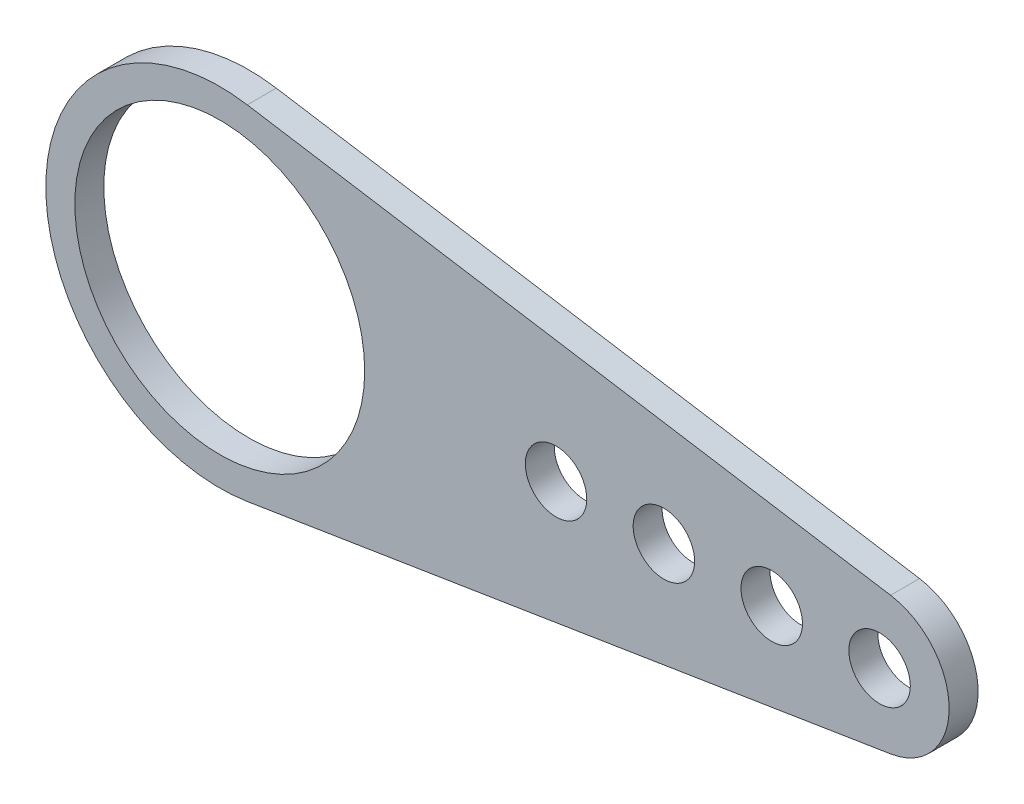
ISO-10303-21;
HEADER;
FILE_DESCRIPTION(('STEP AP214'),'2;1');
FILE_NAME('part.step','',(''),(''),'','','');
FILE_SCHEMA(('AUTOMOTIVE_DESIGN { 1 0 10303 214 1 1 1 1 }'));
ENDSEC;
DATA;
#1=APPLICATION_CONTEXT('core data for automotive mechanical design processes');
#2=APPLICATION_PROTOCOL_DEFINITION('international standard','automotive_design',2000,#1);
#3=PRODUCT_CONTEXT('',#1,'mechanical');
#4=PRODUCT('Part','Part','',(#3));
#5=PRODUCT_RELATED_PRODUCT_CATEGORY('part','',(#4));
#6=PRODUCT_DEFINITION_FORMATION('','',#4);
#7=PRODUCT_DEFINITION_CONTEXT('part definition',#1,'design');
#8=PRODUCT_DEFINITION('design','',#6,#7);
#9=PRODUCT_DEFINITION_SHAPE('','',#8);
#10=(LENGTH_UNIT() NAMED_UNIT(*) SI_UNIT(.MILLI.,.METRE.));
#11=(NAMED_UNIT(*) PLANE_ANGLE_UNIT() SI_UNIT($,.RADIAN.));
#12=(NAMED_UNIT(*) SI_UNIT($,.STERADIAN.) SOLID_ANGLE_UNIT());
#13=UNCERTAINTY_MEASURE_WITH_UNIT(LENGTH_MEASURE(1.E-05),#10,'distance_accuracy_value','');
#14=(GEOMETRIC_REPRESENTATION_CONTEXT(3) GLOBAL_UNCERTAINTY_ASSIGNED_CONTEXT((#13)) GLOBAL_UNIT_ASSIGNED_CONTEXT((#10,
#11,#12)) REPRESENTATION_CONTEXT('',''));
#15=CARTESIAN_POINT('',(0.,0.,0.));
#16=DIRECTION('',(0.,0.,1.));
#17=DIRECTION('',(1.,0.,0.));
#18=AXIS2_PLACEMENT_3D('',#15,#16,#17);
#19=CARTESIAN_POINT('',(0.,0.,3.175));
#20=DIRECTION('',(0.,0.,-1.));
#21=DIRECTION('',(-1.,0.,0.));
#22=AXIS2_PLACEMENT_3D('',#19,#20,#21);
#23=CYLINDRICAL_SURFACE('',#22,19.05);
#24=CARTESIAN_POINT('',(0.,0.,0.));
#25=DIRECTION('',(0.,0.,1.));
#26=DIRECTION('',(1.,0.,0.));
#27=AXIS2_PLACEMENT_3D('',#24,#25,#26);
#28=CIRCLE('',#27,19.05);
#29=CARTESIAN_POINT('',(3.01318101933216,18.8101897955533,0.));
#30=VERTEX_POINT('',#29);
#31=CARTESIAN_POINT('',(3.01318101933216,-18.8101897955533,0.));
#32=VERTEX_POINT('',#31);
#33=EDGE_CURVE('E119',#30,#32,#28,.T.);
#34=ORIENTED_EDGE('',*,*,#33,.T.);
#35=DIRECTION('',(0.,0.,-1.));
#36=VECTOR('',#35,1.);
#37=CARTESIAN_POINT('',(3.01318101933216,-18.8101897955533,3.175));
#38=LINE('',#37,#36);
#39=CARTESIAN_POINT('',(3.01318101933216,-18.8101897955533,3.175));
#40=VERTEX_POINT('',#39);
#41=EDGE_CURVE('E11',#40,#32,#38,.T.);
#42=ORIENTED_EDGE('',*,*,#41,.F.);
#43=CARTESIAN_POINT('',(0.,0.,3.175));
#44=DIRECTION('',(0.,0.,1.));
#45=DIRECTION('',(1.,0.,0.));
#46=AXIS2_PLACEMENT_3D('',#43,#44,#45);
#47=CIRCLE('',#46,19.05);
#48=CARTESIAN_POINT('',(3.01318101933216,18.8101897955533,3.175));
#49=VERTEX_POINT('',#48);
#50=EDGE_CURVE('E97',#49,#40,#47,.T.);
#51=ORIENTED_EDGE('',*,*,#50,.F.);
#52=DIRECTION('',(0.,0.,-1.));
#53=VECTOR('',#52,1.);
#54=CARTESIAN_POINT('',(3.01318101933216,18.8101897955533,3.175));
#55=LINE('',#54,#53);
#56=EDGE_CURVE('E64',#49,#30,#55,.T.);
#57=ORIENTED_EDGE('',*,*,#56,.T.);
#58=EDGE_LOOP('',(#34,#42,#51,#57));
#59=FACE_BOUND('',#58,.T.);
#60=ADVANCED_FACE('F46',(#59),#23,.T.);
#61=CARTESIAN_POINT('',(3.01318101933216,-18.8101897955532,3.175));
#62=DIRECTION('',(-0.15817223198594,0.987411537824319,0.));
#63=DIRECTION('',(-0.987411537824319,-0.15817223198594,0.));
#64=AXIS2_PLACEMENT_3D('',#61,#62,#63);
#65=PLANE('',#64);
#66=DIRECTION('',(0.987411537824319,0.15817223198594,0.));
#67=VECTOR('',#66,1.);
#68=CARTESIAN_POINT('',(3.01318101933216,-18.8101897955532,0.));
#69=LINE('',#68,#67);
#70=CARTESIAN_POINT('',(73.4682724077329,-7.5240759182213,0.));
#71=VERTEX_POINT('',#70);
#72=EDGE_CURVE('E103',#32,#71,#69,.T.);
#73=ORIENTED_EDGE('',*,*,#72,.T.);
#74=DIRECTION('',(0.,0.,-1.));
#75=VECTOR('',#74,1.);
#76=CARTESIAN_POINT('',(73.4682724077329,-7.5240759182213,3.175));
#77=LINE('',#76,#75);
#78=CARTESIAN_POINT('',(73.4682724077329,-7.5240759182213,3.175));
#79=VERTEX_POINT('',#78);
#80=EDGE_CURVE('E56',#79,#71,#77,.T.);
#81=ORIENTED_EDGE('',*,*,#80,.F.);
#82=DIRECTION('',(0.987411537824319,0.15817223198594,0.));
#83=VECTOR('',#82,1.);
#84=CARTESIAN_POINT('',(3.01318101933216,-18.8101897955532,3.175));
#85=LINE('',#84,#83);
#86=EDGE_CURVE('E90',#40,#79,#85,.T.);
#87=ORIENTED_EDGE('',*,*,#86,.F.);
#88=ORIENTED_EDGE('',*,*,#41,.T.);
#89=EDGE_LOOP('',(#73,#81,#87,#88));
#90=FACE_BOUND('',#89,.T.);
#91=ADVANCED_FACE('F102',(#90),#65,.F.);
#92=CARTESIAN_POINT('',(72.263,0.,3.175));
#93=DIRECTION('',(0.,0.,-1.));
#94=DIRECTION('',(-1.,0.,0.));
#95=AXIS2_PLACEMENT_3D('',#92,#93,#94);
#96=CYLINDRICAL_SURFACE('',#95,7.62);
#97=CARTESIAN_POINT('',(72.263,0.,0.));
#98=DIRECTION('',(0.,0.,1.));
#99=DIRECTION('',(1.,0.,0.));
#100=AXIS2_PLACEMENT_3D('',#97,#98,#99);
#101=CIRCLE('',#100,7.62);
#102=CARTESIAN_POINT('',(73.4682724077329,7.5240759182213,0.));
#103=VERTEX_POINT('',#102);
#104=EDGE_CURVE('E125',#71,#103,#101,.T.);
#105=ORIENTED_EDGE('',*,*,#104,.T.);
#106=DIRECTION('',(0.,0.,-1.));
#107=VECTOR('',#106,1.);
#108=CARTESIAN_POINT('',(73.4682724077329,7.5240759182213,3.175));
#109=LINE('',#108,#107);
#110=CARTESIAN_POINT('',(73.4682724077329,7.5240759182213,3.175));
#111=VERTEX_POINT('',#110);
#112=EDGE_CURVE('E79',#111,#103,#109,.T.);
#113=ORIENTED_EDGE('',*,*,#112,.F.);
#114=CARTESIAN_POINT('',(72.263,0.,3.175));
#115=DIRECTION('',(0.,0.,1.));
#116=DIRECTION('',(1.,0.,0.));
#117=AXIS2_PLACEMENT_3D('',#114,#115,#116);
#118=CIRCLE('',#117,7.62);
#119=EDGE_CURVE('E96',#79,#111,#118,.T.);
#120=ORIENTED_EDGE('',*,*,#119,.F.);
#121=ORIENTED_EDGE('',*,*,#80,.T.);
#122=EDGE_LOOP('',(#105,#113,#120,#121));
#123=FACE_BOUND('',#122,.T.);
#124=ADVANCED_FACE('F107',(#123),#96,.T.);
#125=CARTESIAN_POINT('',(0.,0.,3.175));
#126=DIRECTION('',(0.,0.,-1.));
#127=DIRECTION('',(-1.,0.,0.));
#128=AXIS2_PLACEMENT_3D('',#125,#126,#127);
#129=CYLINDRICAL_SURFACE('',#128,15.875);
#130=CARTESIAN_POINT('',(0.,0.,3.175));
#131=DIRECTION('',(0.,0.,1.));
#132=DIRECTION('',(1.,0.,0.));
#133=AXIS2_PLACEMENT_3D('',#130,#131,#132);
#134=CIRCLE('',#133,15.875);
#135=CARTESIAN_POINT('',(15.875,0.,3.175));
#136=VERTEX_POINT('',#135);
#137=EDGE_CURVE('E132',#136,#136,#134,.T.);
#138=ORIENTED_EDGE('',*,*,#137,.T.);
#139=EDGE_LOOP('',(#138));
#140=FACE_BOUND('',#139,.T.);
#141=CARTESIAN_POINT('',(0.,0.,0.));
#142=DIRECTION('',(0.,0.,1.));
#143=DIRECTION('',(1.,0.,0.));
#144=AXIS2_PLACEMENT_3D('',#141,#142,#143);
#145=CIRCLE('',#144,15.875);
#146=CARTESIAN_POINT('',(15.875,0.,0.));
#147=VERTEX_POINT('',#146);
#148=EDGE_CURVE('E115',#147,#147,#145,.T.);
#149=ORIENTED_EDGE('',*,*,#148,.F.);
#150=EDGE_LOOP('',(#149));
#151=FACE_BOUND('',#150,.T.);
#152=ADVANCED_FACE('F48',(#140,#151),#129,.F.);
#153=CARTESIAN_POINT('',(3.01318101933216,18.8101897955532,3.175));
#154=DIRECTION('',(0.15817223198594,0.987411537824319,0.));
#155=DIRECTION('',(-0.987411537824319,0.15817223198594,0.));
#156=AXIS2_PLACEMENT_3D('',#153,#154,#155);
#157=PLANE('',#156);
#158=DIRECTION('',(0.987411537824319,-0.15817223198594,0.));
#159=VECTOR('',#158,1.);
#160=CARTESIAN_POINT('',(3.01318101933216,18.8101897955532,0.));
#161=LINE('',#160,#159);
#162=EDGE_CURVE('E128',#30,#103,#161,.T.);
#163=ORIENTED_EDGE('',*,*,#162,.F.);
#164=ORIENTED_EDGE('',*,*,#56,.F.);
#165=DIRECTION('',(0.987411537824319,-0.15817223198594,0.));
#166=VECTOR('',#165,1.);
#167=CARTESIAN_POINT('',(3.01318101933216,18.8101897955532,3.175));
#168=LINE('',#167,#166);
#169=EDGE_CURVE('E109',#49,#111,#168,.T.);
#170=ORIENTED_EDGE('',*,*,#169,.T.);
#171=ORIENTED_EDGE('',*,*,#112,.T.);
#172=EDGE_LOOP('',(#163,#164,#170,#171));
#173=FACE_BOUND('',#172,.T.);
#174=ADVANCED_FACE('F188',(#173),#157,.T.);
#175=CARTESIAN_POINT('',(0.,0.,3.175));
#176=DIRECTION('',(0.,0.,1.));
#177=DIRECTION('',(1.,0.,0.));
#178=AXIS2_PLACEMENT_3D('',#175,#176,#177);
#179=PLANE('',#178);
#180=CARTESIAN_POINT('',(36.83,0.,3.175));
#181=DIRECTION('',(0.,0.,1.));
#182=DIRECTION('',(1.,0.,0.));
#183=AXIS2_PLACEMENT_3D('',#180,#181,#182);
#184=CIRCLE('',#183,3.36549999999999);
#185=CARTESIAN_POINT('',(40.1955,0.,3.175));
#186=VERTEX_POINT('',#185);
#187=EDGE_CURVE('E120',#186,#186,#184,.T.);
#188=ORIENTED_EDGE('',*,*,#187,.F.);
#189=EDGE_LOOP('',(#188));
#190=FACE_BOUND('',#189,.T.);
#191=CARTESIAN_POINT('',(48.641,0.,3.175));
#192=DIRECTION('',(0.,0.,1.));
#193=DIRECTION('',(1.,0.,0.));
#194=AXIS2_PLACEMENT_3D('',#191,#192,#193);
#195=CIRCLE('',#194,3.36549999999999);
#196=CARTESIAN_POINT('',(52.0065,0.,3.175));
#197=VERTEX_POINT('',#196);
#198=EDGE_CURVE('E161',#197,#197,#195,.T.);
#199=ORIENTED_EDGE('',*,*,#198,.F.);
#200=EDGE_LOOP('',(#199));
#201=FACE_BOUND('',#200,.T.);
#202=CARTESIAN_POINT('',(60.452,0.,3.175));
#203=DIRECTION('',(0.,0.,1.));
#204=DIRECTION('',(1.,0.,0.));
#205=AXIS2_PLACEMENT_3D('',#202,#203,#204);
#206=CIRCLE('',#205,3.36549999999998);
#207=CARTESIAN_POINT('',(63.8175,0.,3.175));
#208=VERTEX_POINT('',#207);
#209=EDGE_CURVE('E153',#208,#208,#206,.T.);
#210=ORIENTED_EDGE('',*,*,#209,.F.);
#211=EDGE_LOOP('',(#210));
#212=FACE_BOUND('',#211,.T.);
#213=CARTESIAN_POINT('',(72.263,0.,3.175));
#214=DIRECTION('',(0.,0.,1.));
#215=DIRECTION('',(1.,0.,0.));
#216=AXIS2_PLACEMENT_3D('',#213,#214,#215);
#217=CIRCLE('',#216,3.36549999999999);
#218=CARTESIAN_POINT('',(75.6285,0.,3.175));
#219=VERTEX_POINT('',#218);
#220=EDGE_CURVE('E144',#219,#219,#217,.T.);
#221=ORIENTED_EDGE('',*,*,#220,.F.);
#222=EDGE_LOOP('',(#221));
#223=FACE_BOUND('',#222,.T.);
#224=ORIENTED_EDGE('',*,*,#137,.F.);
#225=EDGE_LOOP('',(#224));
#226=FACE_BOUND('',#225,.T.);
#227=ORIENTED_EDGE('',*,*,#50,.T.);
#228=ORIENTED_EDGE('',*,*,#86,.T.);
#229=ORIENTED_EDGE('',*,*,#119,.T.);
#230=ORIENTED_EDGE('',*,*,#169,.F.);
#231=EDGE_LOOP('',(#227,#228,#229,#230));
#232=FACE_BOUND('',#231,.T.);
#233=ADVANCED_FACE('F93',(#190,#201,#212,#223,#226,#232),#179,.T.);
#234=CARTESIAN_POINT('',(0.,0.,0.));
#235=DIRECTION('',(0.,0.,1.));
#236=DIRECTION('',(1.,0.,0.));
#237=AXIS2_PLACEMENT_3D('',#234,#235,#236);
#238=PLANE('',#237);
#239=CARTESIAN_POINT('',(36.83,0.,0.));
#240=DIRECTION('',(0.,0.,1.));
#241=DIRECTION('',(1.,0.,0.));
#242=AXIS2_PLACEMENT_3D('',#239,#240,#241);
#243=CIRCLE('',#242,3.36549999999999);
#244=CARTESIAN_POINT('',(40.1955,0.,0.));
#245=VERTEX_POINT('',#244);
#246=EDGE_CURVE('E165',#245,#245,#243,.T.);
#247=ORIENTED_EDGE('',*,*,#246,.T.);
#248=EDGE_LOOP('',(#247));
#249=FACE_BOUND('',#248,.T.);
#250=CARTESIAN_POINT('',(48.641,0.,0.));
#251=DIRECTION('',(0.,0.,1.));
#252=DIRECTION('',(1.,0.,0.));
#253=AXIS2_PLACEMENT_3D('',#250,#251,#252);
#254=CIRCLE('',#253,3.36549999999999);
#255=CARTESIAN_POINT('',(52.0065,0.,0.));
#256=VERTEX_POINT('',#255);
#257=EDGE_CURVE('E157',#256,#256,#254,.T.);
#258=ORIENTED_EDGE('',*,*,#257,.T.);
#259=EDGE_LOOP('',(#258));
#260=FACE_BOUND('',#259,.T.);
#261=CARTESIAN_POINT('',(60.452,0.,0.));
#262=DIRECTION('',(0.,0.,1.));
#263=DIRECTION('',(1.,0.,0.));
#264=AXIS2_PLACEMENT_3D('',#261,#262,#263);
#265=CIRCLE('',#264,3.36549999999998);
#266=CARTESIAN_POINT('',(63.8175,0.,0.));
#267=VERTEX_POINT('',#266);
#268=EDGE_CURVE('E148',#267,#267,#265,.T.);
#269=ORIENTED_EDGE('',*,*,#268,.T.);
#270=EDGE_LOOP('',(#269));
#271=FACE_BOUND('',#270,.T.);
#272=CARTESIAN_POINT('',(72.263,0.,0.));
#273=DIRECTION('',(0.,0.,1.));
#274=DIRECTION('',(1.,0.,0.));
#275=AXIS2_PLACEMENT_3D('',#272,#273,#274);
#276=CIRCLE('',#275,3.36549999999999);
#277=CARTESIAN_POINT('',(75.6285,0.,0.));
#278=VERTEX_POINT('',#277);
#279=EDGE_CURVE('E149',#278,#278,#276,.T.);
#280=ORIENTED_EDGE('',*,*,#279,.T.);
#281=EDGE_LOOP('',(#280));
#282=FACE_BOUND('',#281,.T.);
#283=ORIENTED_EDGE('',*,*,#148,.T.);
#284=EDGE_LOOP('',(#283));
#285=FACE_BOUND('',#284,.T.);
#286=ORIENTED_EDGE('',*,*,#33,.F.);
#287=ORIENTED_EDGE('',*,*,#162,.T.);
#288=ORIENTED_EDGE('',*,*,#104,.F.);
#289=ORIENTED_EDGE('',*,*,#72,.F.);
#290=EDGE_LOOP('',(#286,#287,#288,#289));
#291=FACE_BOUND('',#290,.T.);
#292=ADVANCED_FACE('F176',(#249,#260,#271,#282,#285,#291),#238,.F.);
#293=CARTESIAN_POINT('',(72.263,0.,12.6940714883333));
#294=DIRECTION('',(0.,0.,-1.));
#295=DIRECTION('',(-1.,0.,0.));
#296=AXIS2_PLACEMENT_3D('',#293,#294,#295);
#297=CYLINDRICAL_SURFACE('',#296,3.36549999999999);
#298=ORIENTED_EDGE('',*,*,#279,.F.);
#299=EDGE_LOOP('',(#298));
#300=FACE_BOUND('',#299,.T.);
#301=ORIENTED_EDGE('',*,*,#220,.T.);
#302=EDGE_LOOP('',(#301));
#303=FACE_BOUND('',#302,.T.);
#304=ADVANCED_FACE('F197',(#300,#303),#297,.F.);
#305=CARTESIAN_POINT('',(60.452,0.,12.6940714883333));
#306=DIRECTION('',(0.,0.,-1.));
#307=DIRECTION('',(-1.,0.,0.));
#308=AXIS2_PLACEMENT_3D('',#305,#306,#307);
#309=CYLINDRICAL_SURFACE('',#308,3.36549999999998);
#310=ORIENTED_EDGE('',*,*,#268,.F.);
#311=EDGE_LOOP('',(#310));
#312=FACE_BOUND('',#311,.T.);
#313=ORIENTED_EDGE('',*,*,#209,.T.);
#314=EDGE_LOOP('',(#313));
#315=FACE_BOUND('',#314,.T.);
#316=ADVANCED_FACE('F199',(#312,#315),#309,.F.);
#317=CARTESIAN_POINT('',(48.641,0.,12.6940714883333));
#318=DIRECTION('',(0.,0.,-1.));
#319=DIRECTION('',(-1.,0.,0.));
#320=AXIS2_PLACEMENT_3D('',#317,#318,#319);
#321=CYLINDRICAL_SURFACE('',#320,3.36549999999999);
#322=ORIENTED_EDGE('',*,*,#257,.F.);
#323=EDGE_LOOP('',(#322));
#324=FACE_BOUND('',#323,.T.);
#325=ORIENTED_EDGE('',*,*,#198,.T.);
#326=EDGE_LOOP('',(#325));
#327=FACE_BOUND('',#326,.T.);
#328=ADVANCED_FACE('F182',(#324,#327),#321,.F.);
#329=CARTESIAN_POINT('',(36.83,0.,12.6940714883333));
#330=DIRECTION('',(0.,0.,-1.));
#331=DIRECTION('',(-1.,0.,0.));
#332=AXIS2_PLACEMENT_3D('',#329,#330,#331);
#333=CYLINDRICAL_SURFACE('',#332,3.36549999999999);
#334=ORIENTED_EDGE('',*,*,#246,.F.);
#335=EDGE_LOOP('',(#334));
#336=FACE_BOUND('',#335,.T.);
#337=ORIENTED_EDGE('',*,*,#187,.T.);
#338=EDGE_LOOP('',(#337));
#339=FACE_BOUND('',#338,.T.);
#340=ADVANCED_FACE('F179',(#336,#339),#333,.F.);
#341=CLOSED_SHELL('',(#60,#91,#124,#152,#174,#233,#292,#304,#316,#328,#340));
#342=MANIFOLD_SOLID_BREP('B2',#341);
#343=ADVANCED_BREP_SHAPE_REPRESENTATION('',(#18,#342),#14);
#344=SHAPE_DEFINITION_REPRESENTATION(#9,#343);
ENDSEC;
END-ISO-10303-21;
